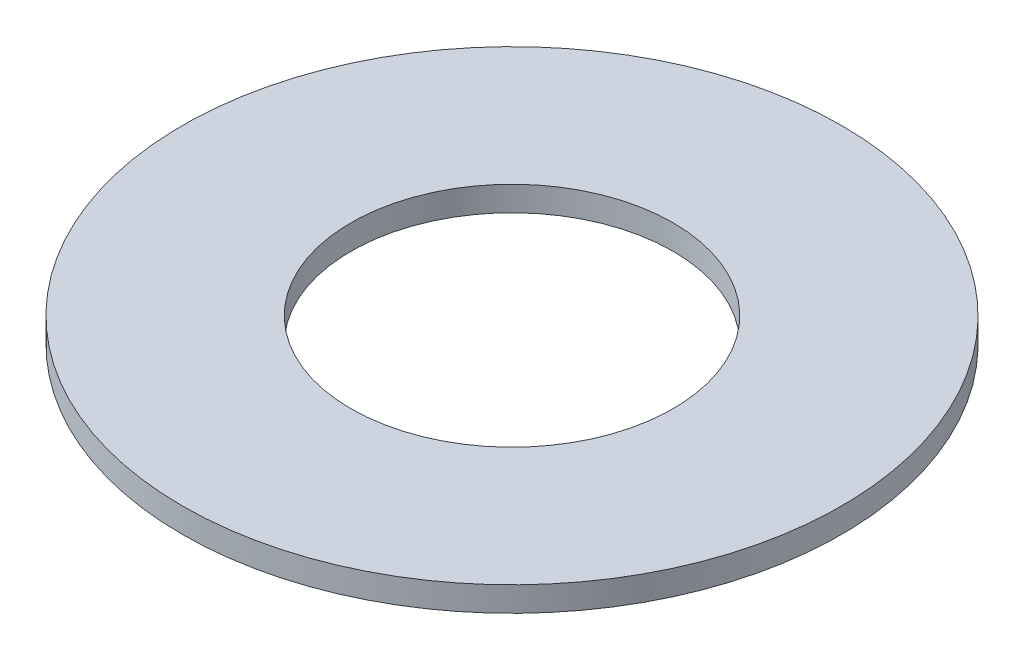
ISO-10303-21;
HEADER;
FILE_DESCRIPTION(('STEP AP214'),'2;1');
FILE_NAME('part.step','',(''),(''),'','','');
FILE_SCHEMA(('AUTOMOTIVE_DESIGN { 1 0 10303 214 1 1 1 1 }'));
ENDSEC;
DATA;
#1=APPLICATION_CONTEXT('core data for automotive mechanical design processes');
#2=APPLICATION_PROTOCOL_DEFINITION('international standard','automotive_design',2000,#1);
#3=PRODUCT_CONTEXT('',#1,'mechanical');
#4=PRODUCT('Part','Part','',(#3));
#5=PRODUCT_RELATED_PRODUCT_CATEGORY('part','',(#4));
#6=PRODUCT_DEFINITION_FORMATION('','',#4);
#7=PRODUCT_DEFINITION_CONTEXT('part definition',#1,'design');
#8=PRODUCT_DEFINITION('design','',#6,#7);
#9=PRODUCT_DEFINITION_SHAPE('','',#8);
#10=(LENGTH_UNIT() NAMED_UNIT(*) SI_UNIT(.MILLI.,.METRE.));
#11=(NAMED_UNIT(*) PLANE_ANGLE_UNIT() SI_UNIT($,.RADIAN.));
#12=(NAMED_UNIT(*) SI_UNIT($,.STERADIAN.) SOLID_ANGLE_UNIT());
#13=UNCERTAINTY_MEASURE_WITH_UNIT(LENGTH_MEASURE(1.E-05),#10,'distance_accuracy_value','');
#14=(GEOMETRIC_REPRESENTATION_CONTEXT(3) GLOBAL_UNCERTAINTY_ASSIGNED_CONTEXT((#13)) GLOBAL_UNIT_ASSIGNED_CONTEXT((#10,
#11,#12)) REPRESENTATION_CONTEXT('',''));
#15=CARTESIAN_POINT('',(0.,0.,0.));
#16=DIRECTION('',(0.,0.,1.));
#17=DIRECTION('',(1.,0.,0.));
#18=AXIS2_PLACEMENT_3D('',#15,#16,#17);
#19=CARTESIAN_POINT('',(0.,4.5,0.));
#20=DIRECTION('',(0.,-1.,0.));
#21=DIRECTION('',(0.,0.,-1.));
#22=AXIS2_PLACEMENT_3D('',#19,#20,#21);
#23=CYLINDRICAL_SURFACE('',#22,60.);
#24=CARTESIAN_POINT('',(0.,4.5,0.));
#25=DIRECTION('',(0.,1.,0.));
#26=DIRECTION('',(0.,0.,1.));
#27=AXIS2_PLACEMENT_3D('',#24,#25,#26);
#28=CIRCLE('',#27,60.);
#29=CARTESIAN_POINT('',(0.,4.5,60.));
#30=VERTEX_POINT('',#29);
#31=EDGE_CURVE('E10',#30,#30,#28,.T.);
#32=ORIENTED_EDGE('',*,*,#31,.F.);
#33=EDGE_LOOP('',(#32));
#34=FACE_BOUND('',#33,.T.);
#35=CARTESIAN_POINT('',(0.,0.,0.));
#36=DIRECTION('',(0.,1.,0.));
#37=DIRECTION('',(0.,0.,1.));
#38=AXIS2_PLACEMENT_3D('',#35,#36,#37);
#39=CIRCLE('',#38,60.);
#40=CARTESIAN_POINT('',(0.,0.,60.));
#41=VERTEX_POINT('',#40);
#42=EDGE_CURVE('E34',#41,#41,#39,.T.);
#43=ORIENTED_EDGE('',*,*,#42,.T.);
#44=EDGE_LOOP('',(#43));
#45=FACE_BOUND('',#44,.T.);
#46=ADVANCED_FACE('F31',(#34,#45),#23,.T.);
#47=CARTESIAN_POINT('',(0.,4.5,0.));
#48=DIRECTION('',(0.,1.,0.));
#49=DIRECTION('',(0.,0.,1.));
#50=AXIS2_PLACEMENT_3D('',#47,#48,#49);
#51=PLANE('',#50);
#52=CARTESIAN_POINT('',(0.,4.5,0.));
#53=DIRECTION('',(0.,1.,0.));
#54=DIRECTION('',(0.,0.,1.));
#55=AXIS2_PLACEMENT_3D('',#52,#53,#54);
#56=CIRCLE('',#55,29.325);
#57=CARTESIAN_POINT('',(0.,4.5,29.325));
#58=VERTEX_POINT('',#57);
#59=EDGE_CURVE('E41',#58,#58,#56,.T.);
#60=ORIENTED_EDGE('',*,*,#59,.F.);
#61=EDGE_LOOP('',(#60));
#62=FACE_BOUND('',#61,.T.);
#63=ORIENTED_EDGE('',*,*,#31,.T.);
#64=EDGE_LOOP('',(#63));
#65=FACE_BOUND('',#64,.T.);
#66=ADVANCED_FACE('F59',(#62,#65),#51,.T.);
#67=CARTESIAN_POINT('',(0.,0.,0.));
#68=DIRECTION('',(0.,1.,0.));
#69=DIRECTION('',(0.,0.,1.));
#70=AXIS2_PLACEMENT_3D('',#67,#68,#69);
#71=PLANE('',#70);
#72=CARTESIAN_POINT('',(0.,0.,0.));
#73=DIRECTION('',(0.,1.,0.));
#74=DIRECTION('',(0.,0.,1.));
#75=AXIS2_PLACEMENT_3D('',#72,#73,#74);
#76=CIRCLE('',#75,29.325);
#77=CARTESIAN_POINT('',(0.,0.,29.325));
#78=VERTEX_POINT('',#77);
#79=EDGE_CURVE('E45',#78,#78,#76,.T.);
#80=ORIENTED_EDGE('',*,*,#79,.T.);
#81=EDGE_LOOP('',(#80));
#82=FACE_BOUND('',#81,.T.);
#83=ORIENTED_EDGE('',*,*,#42,.F.);
#84=EDGE_LOOP('',(#83));
#85=FACE_BOUND('',#84,.T.);
#86=ADVANCED_FACE('F49',(#82,#85),#71,.F.);
#87=CARTESIAN_POINT('',(0.,0.,0.));
#88=DIRECTION('',(0.,1.,0.));
#89=DIRECTION('',(0.,0.,1.));
#90=AXIS2_PLACEMENT_3D('',#87,#88,#89);
#91=CYLINDRICAL_SURFACE('',#90,29.325);
#92=ORIENTED_EDGE('',*,*,#59,.T.);
#93=EDGE_LOOP('',(#92));
#94=FACE_BOUND('',#93,.T.);
#95=ORIENTED_EDGE('',*,*,#79,.F.);
#96=EDGE_LOOP('',(#95));
#97=FACE_BOUND('',#96,.T.);
#98=ADVANCED_FACE('F52',(#94,#97),#91,.F.);
#99=CLOSED_SHELL('',(#46,#66,#86,#98));
#100=MANIFOLD_SOLID_BREP('B2',#99);
#101=ADVANCED_BREP_SHAPE_REPRESENTATION('',(#18,#100),#14);
#102=SHAPE_DEFINITION_REPRESENTATION(#9,#101);
ENDSEC;
END-ISO-10303-21;
